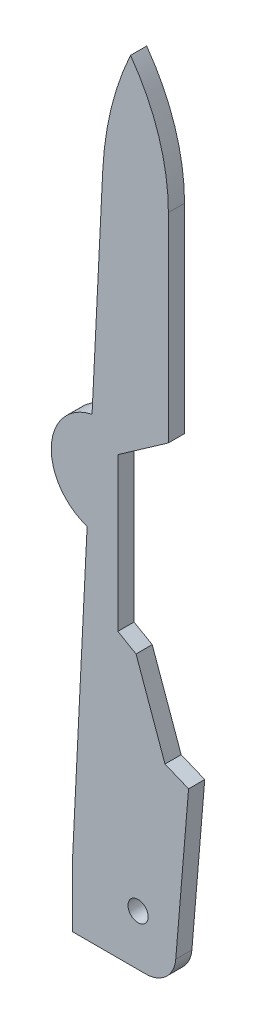
ISO-10303-21;
HEADER;
FILE_DESCRIPTION(('STEP AP214'),'2;1');
FILE_NAME('part.step','',(''),(''),'','','');
FILE_SCHEMA(('AUTOMOTIVE_DESIGN { 1 0 10303 214 1 1 1 1 }'));
ENDSEC;
DATA;
#1=APPLICATION_CONTEXT('core data for automotive mechanical design processes');
#2=APPLICATION_PROTOCOL_DEFINITION('international standard','automotive_design',2000,#1);
#3=PRODUCT_CONTEXT('',#1,'mechanical');
#4=PRODUCT('Part','Part','',(#3));
#5=PRODUCT_RELATED_PRODUCT_CATEGORY('part','',(#4));
#6=PRODUCT_DEFINITION_FORMATION('','',#4);
#7=PRODUCT_DEFINITION_CONTEXT('part definition',#1,'design');
#8=PRODUCT_DEFINITION('design','',#6,#7);
#9=PRODUCT_DEFINITION_SHAPE('','',#8);
#10=(LENGTH_UNIT() NAMED_UNIT(*) SI_UNIT(.MILLI.,.METRE.));
#11=(NAMED_UNIT(*) PLANE_ANGLE_UNIT() SI_UNIT($,.RADIAN.));
#12=(NAMED_UNIT(*) SI_UNIT($,.STERADIAN.) SOLID_ANGLE_UNIT());
#13=UNCERTAINTY_MEASURE_WITH_UNIT(LENGTH_MEASURE(1.E-05),#10,'distance_accuracy_value','');
#14=(GEOMETRIC_REPRESENTATION_CONTEXT(3) GLOBAL_UNCERTAINTY_ASSIGNED_CONTEXT((#13)) GLOBAL_UNIT_ASSIGNED_CONTEXT((#10,
#11,#12)) REPRESENTATION_CONTEXT('',''));
#15=CARTESIAN_POINT('',(0.,0.,0.));
#16=DIRECTION('',(0.,0.,1.));
#17=DIRECTION('',(1.,0.,0.));
#18=AXIS2_PLACEMENT_3D('',#15,#16,#17);
#19=CARTESIAN_POINT('',(-10.3297860874718,66.3956518642348,0.8));
#20=DIRECTION('',(0.,0.,-1.));
#21=DIRECTION('',(-1.,0.,0.));
#22=AXIS2_PLACEMENT_3D('',#19,#20,#21);
#23=CYLINDRICAL_SURFACE('',#22,19.8297860874718);
#24=CARTESIAN_POINT('',(-10.3297860874718,66.3956518642348,-0.8));
#25=DIRECTION('',(0.,0.,1.));
#26=DIRECTION('',(1.,0.,0.));
#27=AXIS2_PLACEMENT_3D('',#24,#25,#26);
#28=CIRCLE('',#27,19.8297860874718);
#29=CARTESIAN_POINT('',(5.75,78.,-0.8));
#30=VERTEX_POINT('',#29);
#31=CARTESIAN_POINT('',(9.5,66.3956518642348,-0.8));
#32=VERTEX_POINT('',#31);
#33=EDGE_CURVE('E150',#30,#32,#28,.F.);
#34=ORIENTED_EDGE('',*,*,#33,.F.);
#35=DIRECTION('',(0.,0.,-1.));
#36=VECTOR('',#35,1.);
#37=CARTESIAN_POINT('',(5.75,78.,0.8));
#38=LINE('',#37,#36);
#39=CARTESIAN_POINT('',(5.75,78.,0.8));
#40=VERTEX_POINT('',#39);
#41=EDGE_CURVE('E145',#40,#30,#38,.T.);
#42=ORIENTED_EDGE('',*,*,#41,.F.);
#43=CARTESIAN_POINT('',(-10.3297860874718,66.3956518642348,0.8));
#44=DIRECTION('',(0.,0.,1.));
#45=DIRECTION('',(1.,0.,0.));
#46=AXIS2_PLACEMENT_3D('',#43,#44,#45);
#47=CIRCLE('',#46,19.8297860874718);
#48=CARTESIAN_POINT('',(9.5,66.3956518642348,0.8));
#49=VERTEX_POINT('',#48);
#50=EDGE_CURVE('E147',#40,#49,#47,.F.);
#51=ORIENTED_EDGE('',*,*,#50,.T.);
#52=DIRECTION('',(0.,0.,-1.));
#53=VECTOR('',#52,1.);
#54=CARTESIAN_POINT('',(9.5,66.3956518642348,0.8));
#55=LINE('',#54,#53);
#56=EDGE_CURVE('E216',#49,#32,#55,.T.);
#57=ORIENTED_EDGE('',*,*,#56,.T.);
#58=EDGE_LOOP('',(#34,#42,#51,#57));
#59=FACE_BOUND('',#58,.T.);
#60=ADVANCED_FACE('F39',(#59),#23,.T.);
#61=CARTESIAN_POINT('',(33.3163707689621,65.310181743202,0.8));
#62=DIRECTION('',(0.,0.,-1.));
#63=DIRECTION('',(-1.,0.,0.));
#64=AXIS2_PLACEMENT_3D('',#61,#62,#63);
#65=CYLINDRICAL_SURFACE('',#64,30.3469320486017);
#66=CARTESIAN_POINT('',(33.3163707689621,65.310181743202,-0.8));
#67=DIRECTION('',(0.,0.,1.));
#68=DIRECTION('',(1.,0.,0.));
#69=AXIS2_PLACEMENT_3D('',#66,#67,#68);
#70=CIRCLE('',#69,30.3469320486017);
#71=CARTESIAN_POINT('',(3.00646147496188,66.808742169722,-0.8));
#72=VERTEX_POINT('',#71);
#73=EDGE_CURVE('E219',#72,#30,#70,.F.);
#74=ORIENTED_EDGE('',*,*,#73,.F.);
#75=DIRECTION('',(0.,0.,-1.));
#76=VECTOR('',#75,1.);
#77=CARTESIAN_POINT('',(3.00646147496188,66.808742169722,0.8));
#78=LINE('',#77,#76);
#79=CARTESIAN_POINT('',(3.00646147496188,66.808742169722,0.8));
#80=VERTEX_POINT('',#79);
#81=EDGE_CURVE('E157',#80,#72,#78,.T.);
#82=ORIENTED_EDGE('',*,*,#81,.F.);
#83=CARTESIAN_POINT('',(33.3163707689621,65.310181743202,0.8));
#84=DIRECTION('',(0.,0.,1.));
#85=DIRECTION('',(1.,0.,0.));
#86=AXIS2_PLACEMENT_3D('',#83,#84,#85);
#87=CIRCLE('',#86,30.3469320486017);
#88=EDGE_CURVE('E163',#80,#40,#87,.F.);
#89=ORIENTED_EDGE('',*,*,#88,.T.);
#90=ORIENTED_EDGE('',*,*,#41,.T.);
#91=EDGE_LOOP('',(#74,#82,#89,#90));
#92=FACE_BOUND('',#91,.T.);
#93=ADVANCED_FACE('F171',(#92),#65,.T.);
#94=CARTESIAN_POINT('',(-0.29592425459345,0.0146308711411731,0.8));
#95=DIRECTION('',(-0.998780016558437,0.0493809530439505,0.));
#96=DIRECTION('',(-0.0493809530439505,-0.998780016558437,0.));
#97=AXIS2_PLACEMENT_3D('',#94,#95,#96);
#98=PLANE('',#97);
#99=DIRECTION('',(0.0493809530439505,0.998780016558437,0.));
#100=VECTOR('',#99,1.);
#101=CARTESIAN_POINT('',(-0.29592425459345,0.0146308711411731,-0.8));
#102=LINE('',#101,#100);
#103=CARTESIAN_POINT('',(1.9444534210038,45.3285487685662,-0.8));
#104=VERTEX_POINT('',#103);
#105=EDGE_CURVE('E223',#104,#72,#102,.T.);
#106=ORIENTED_EDGE('',*,*,#105,.F.);
#107=DIRECTION('',(0.,0.,-1.));
#108=VECTOR('',#107,1.);
#109=CARTESIAN_POINT('',(1.9444534210038,45.3285487685662,0.8));
#110=LINE('',#109,#108);
#111=CARTESIAN_POINT('',(1.9444534210038,45.3285487685662,0.8));
#112=VERTEX_POINT('',#111);
#113=EDGE_CURVE('E295',#112,#104,#110,.T.);
#114=ORIENTED_EDGE('',*,*,#113,.F.);
#115=DIRECTION('',(0.0493809530439505,0.998780016558437,0.));
#116=VECTOR('',#115,1.);
#117=CARTESIAN_POINT('',(-0.29592425459345,0.0146308711411731,0.8));
#118=LINE('',#117,#116);
#119=EDGE_CURVE('E173',#112,#80,#118,.T.);
#120=ORIENTED_EDGE('',*,*,#119,.T.);
#121=ORIENTED_EDGE('',*,*,#81,.T.);
#122=EDGE_LOOP('',(#106,#114,#120,#121));
#123=FACE_BOUND('',#122,.T.);
#124=ADVANCED_FACE('F353',(#123),#98,.T.);
#125=CARTESIAN_POINT('',(3.00646147496188,40.3403488033154,0.8));
#126=DIRECTION('',(0.,0.,-1.));
#127=DIRECTION('',(-1.,0.,0.));
#128=AXIS2_PLACEMENT_3D('',#125,#126,#127);
#129=CYLINDRICAL_SURFACE('',#128,5.1);
#130=CARTESIAN_POINT('',(3.00646147496188,40.3403488033154,-0.8));
#131=DIRECTION('',(0.,0.,1.));
#132=DIRECTION('',(1.,0.,0.));
#133=AXIS2_PLACEMENT_3D('',#130,#131,#132);
#134=CIRCLE('',#133,5.1);
#135=CARTESIAN_POINT('',(1.45758966983994,35.4812340556172,-0.8));
#136=VERTEX_POINT('',#135);
#137=EDGE_CURVE('E227',#104,#136,#134,.T.);
#138=ORIENTED_EDGE('',*,*,#137,.T.);
#139=DIRECTION('',(0.,0.,-1.));
#140=VECTOR('',#139,1.);
#141=CARTESIAN_POINT('',(1.45758966983994,35.4812340556172,0.8));
#142=LINE('',#141,#140);
#143=CARTESIAN_POINT('',(1.45758966983994,35.4812340556172,0.8));
#144=VERTEX_POINT('',#143);
#145=EDGE_CURVE('E292',#144,#136,#142,.T.);
#146=ORIENTED_EDGE('',*,*,#145,.F.);
#147=CARTESIAN_POINT('',(3.00646147496188,40.3403488033154,0.8));
#148=DIRECTION('',(0.,0.,1.));
#149=DIRECTION('',(1.,0.,0.));
#150=AXIS2_PLACEMENT_3D('',#147,#148,#149);
#151=CIRCLE('',#150,5.1);
#152=EDGE_CURVE('E176',#112,#144,#151,.T.);
#153=ORIENTED_EDGE('',*,*,#152,.F.);
#154=ORIENTED_EDGE('',*,*,#113,.T.);
#155=EDGE_LOOP('',(#138,#146,#153,#154));
#156=FACE_BOUND('',#155,.T.);
#157=ADVANCED_FACE('F355',(#156),#129,.T.);
#158=CARTESIAN_POINT('',(0.,6.,-0.8));
#159=VERTEX_POINT('',#158);
#160=EDGE_CURVE('E228',#159,#136,#102,.T.);
#161=ORIENTED_EDGE('',*,*,#160,.F.);
#162=DIRECTION('',(0.,0.,-1.));
#163=VECTOR('',#162,1.);
#164=CARTESIAN_POINT('',(0.,6.,0.8));
#165=LINE('',#164,#163);
#166=CARTESIAN_POINT('',(0.,6.,0.8));
#167=VERTEX_POINT('',#166);
#168=EDGE_CURVE('E289',#167,#159,#165,.T.);
#169=ORIENTED_EDGE('',*,*,#168,.F.);
#170=EDGE_CURVE('E178',#167,#144,#118,.T.);
#171=ORIENTED_EDGE('',*,*,#170,.T.);
#172=ORIENTED_EDGE('',*,*,#145,.T.);
#173=EDGE_LOOP('',(#161,#169,#171,#172));
#174=FACE_BOUND('',#173,.T.);
#175=ADVANCED_FACE('F310',(#174),#98,.T.);
#176=CARTESIAN_POINT('',(0.,0.,0.8));
#177=DIRECTION('',(-1.,0.,0.));
#178=DIRECTION('',(0.,0.,1.));
#179=AXIS2_PLACEMENT_3D('',#176,#177,#178);
#180=PLANE('',#179);
#181=DIRECTION('',(0.,1.,0.));
#182=VECTOR('',#181,1.);
#183=CARTESIAN_POINT('',(0.,0.,-0.8));
#184=LINE('',#183,#182);
#185=CARTESIAN_POINT('',(0.,0.,-0.8));
#186=VERTEX_POINT('',#185);
#187=EDGE_CURVE('E232',#186,#159,#184,.T.);
#188=ORIENTED_EDGE('',*,*,#187,.F.);
#189=DIRECTION('',(0.,0.,-1.));
#190=VECTOR('',#189,1.);
#191=CARTESIAN_POINT('',(0.,0.,0.8));
#192=LINE('',#191,#190);
#193=CARTESIAN_POINT('',(0.,0.,0.8));
#194=VERTEX_POINT('',#193);
#195=EDGE_CURVE('E285',#194,#186,#192,.T.);
#196=ORIENTED_EDGE('',*,*,#195,.F.);
#197=DIRECTION('',(0.,1.,0.));
#198=VECTOR('',#197,1.);
#199=CARTESIAN_POINT('',(0.,0.,0.8));
#200=LINE('',#199,#198);
#201=EDGE_CURVE('E183',#194,#167,#200,.T.);
#202=ORIENTED_EDGE('',*,*,#201,.T.);
#203=ORIENTED_EDGE('',*,*,#168,.T.);
#204=EDGE_LOOP('',(#188,#196,#202,#203));
#205=FACE_BOUND('',#204,.T.);
#206=ADVANCED_FACE('F317',(#205),#180,.T.);
#207=CARTESIAN_POINT('',(0.,0.,0.8));
#208=DIRECTION('',(0.,-1.,0.));
#209=DIRECTION('',(0.,0.,-1.));
#210=AXIS2_PLACEMENT_3D('',#207,#208,#209);
#211=PLANE('',#210);
#212=DIRECTION('',(-1.,0.,0.));
#213=VECTOR('',#212,1.);
#214=CARTESIAN_POINT('',(0.,0.,-0.8));
#215=LINE('',#214,#213);
#216=CARTESIAN_POINT('',(7.23966996599457,0.,-0.8));
#217=VERTEX_POINT('',#216);
#218=EDGE_CURVE('E236',#217,#186,#215,.T.);
#219=ORIENTED_EDGE('',*,*,#218,.F.);
#220=DIRECTION('',(0.,0.,-1.));
#221=VECTOR('',#220,1.);
#222=CARTESIAN_POINT('',(7.23966996599457,0.,0.8));
#223=LINE('',#222,#221);
#224=CARTESIAN_POINT('',(7.23966996599457,0.,0.8));
#225=VERTEX_POINT('',#224);
#226=EDGE_CURVE('E48',#217,#225,#223,.F.);
#227=ORIENTED_EDGE('',*,*,#226,.T.);
#228=DIRECTION('',(-1.,0.,0.));
#229=VECTOR('',#228,1.);
#230=CARTESIAN_POINT('',(0.,0.,0.8));
#231=LINE('',#230,#229);
#232=EDGE_CURVE('E187',#225,#194,#231,.T.);
#233=ORIENTED_EDGE('',*,*,#232,.T.);
#234=ORIENTED_EDGE('',*,*,#195,.T.);
#235=EDGE_LOOP('',(#219,#227,#233,#234));
#236=FACE_BOUND('',#235,.T.);
#237=ADVANCED_FACE('F318',(#236),#211,.T.);
#238=CARTESIAN_POINT('',(9.93099347844725,-0.827830487183667,0.8));
#239=DIRECTION('',(0.996543700920699,-0.0830701640498897,0.));
#240=DIRECTION('',(0.0830701640498897,0.9965437009207,0.));
#241=AXIS2_PLACEMENT_3D('',#238,#239,#240);
#242=PLANE('',#241);
#243=DIRECTION('',(-0.0830701640498897,-0.9965437009207,0.));
#244=VECTOR('',#243,1.);
#245=CARTESIAN_POINT('',(9.93099347844725,-0.827830487183667,0.8));
#246=LINE('',#245,#244);
#247=CARTESIAN_POINT('',(11.5,17.9946141731862,0.8));
#248=VERTEX_POINT('',#247);
#249=CARTESIAN_POINT('',(10.2293010687567,2.75078950785033,0.8));
#250=VERTEX_POINT('',#249);
#251=EDGE_CURVE('E190',#248,#250,#246,.T.);
#252=ORIENTED_EDGE('',*,*,#251,.T.);
#253=DIRECTION('',(0.,0.,-1.));
#254=VECTOR('',#253,1.);
#255=CARTESIAN_POINT('',(10.2293010687567,2.75078950785033,0.8));
#256=LINE('',#255,#254);
#257=CARTESIAN_POINT('',(10.2293010687567,2.75078950785033,-0.8));
#258=VERTEX_POINT('',#257);
#259=EDGE_CURVE('E156',#250,#258,#256,.T.);
#260=ORIENTED_EDGE('',*,*,#259,.T.);
#261=DIRECTION('',(-0.0830701640498897,-0.9965437009207,0.));
#262=VECTOR('',#261,1.);
#263=CARTESIAN_POINT('',(9.93099347844725,-0.827830487183667,-0.8));
#264=LINE('',#263,#262);
#265=CARTESIAN_POINT('',(11.5,17.9946141731862,-0.8));
#266=VERTEX_POINT('',#265);
#267=EDGE_CURVE('E239',#266,#258,#264,.T.);
#268=ORIENTED_EDGE('',*,*,#267,.F.);
#269=DIRECTION('',(0.,0.,-1.));
#270=VECTOR('',#269,1.);
#271=CARTESIAN_POINT('',(11.5,17.9946141731862,0.8));
#272=LINE('',#271,#270);
#273=EDGE_CURVE('E282',#248,#266,#272,.T.);
#274=ORIENTED_EDGE('',*,*,#273,.F.);
#275=EDGE_LOOP('',(#252,#260,#268,#274));
#276=FACE_BOUND('',#275,.T.);
#277=ADVANCED_FACE('F325',(#276),#242,.T.);
#278=CARTESIAN_POINT('',(7.97304082843186,19.4410671511285,0.8));
#279=DIRECTION('',(0.379443046104791,0.925215096484443,0.));
#280=DIRECTION('',(-0.925215096484443,0.379443046104791,0.));
#281=AXIS2_PLACEMENT_3D('',#278,#279,#280);
#282=PLANE('',#281);
#283=DIRECTION('',(0.925215096484443,-0.379443046104791,0.));
#284=VECTOR('',#283,1.);
#285=CARTESIAN_POINT('',(7.97304082843186,19.4410671511285,-0.8));
#286=LINE('',#285,#284);
#287=CARTESIAN_POINT('',(9.16578800343431,18.9519056328659,-0.8));
#288=VERTEX_POINT('',#287);
#289=EDGE_CURVE('E242',#288,#266,#286,.T.);
#290=ORIENTED_EDGE('',*,*,#289,.F.);
#291=DIRECTION('',(0.,0.,-1.));
#292=VECTOR('',#291,1.);
#293=CARTESIAN_POINT('',(9.16578800343431,18.9519056328659,0.8));
#294=LINE('',#293,#292);
#295=CARTESIAN_POINT('',(9.16578800343431,18.9519056328659,0.8));
#296=VERTEX_POINT('',#295);
#297=EDGE_CURVE('E279',#296,#288,#294,.T.);
#298=ORIENTED_EDGE('',*,*,#297,.F.);
#299=DIRECTION('',(0.925215096484443,-0.379443046104791,0.));
#300=VECTOR('',#299,1.);
#301=CARTESIAN_POINT('',(7.97304082843186,19.4410671511285,0.8));
#302=LINE('',#301,#300);
#303=EDGE_CURVE('E194',#296,#248,#302,.T.);
#304=ORIENTED_EDGE('',*,*,#303,.T.);
#305=ORIENTED_EDGE('',*,*,#273,.T.);
#306=EDGE_LOOP('',(#290,#298,#304,#305));
#307=FACE_BOUND('',#306,.T.);
#308=ADVANCED_FACE('F330',(#307),#282,.T.);
#309=CARTESIAN_POINT('',(14.1390515593719,5.06273948105965,0.8));
#310=DIRECTION('',(0.941465766924734,0.337108602246847,0.));
#311=DIRECTION('',(-0.337108602246847,0.941465766924734,0.));
#312=AXIS2_PLACEMENT_3D('',#309,#310,#311);
#313=PLANE('',#312);
#314=DIRECTION('',(0.337108602246847,-0.941465766924734,0.));
#315=VECTOR('',#314,1.);
#316=CARTESIAN_POINT('',(14.1390515593719,5.06273948105965,-0.8));
#317=LINE('',#316,#315);
#318=CARTESIAN_POINT('',(6.3,26.9553836886449,-0.8));
#319=VERTEX_POINT('',#318);
#320=EDGE_CURVE('E246',#319,#288,#317,.T.);
#321=ORIENTED_EDGE('',*,*,#320,.F.);
#322=DIRECTION('',(0.,0.,-1.));
#323=VECTOR('',#322,1.);
#324=CARTESIAN_POINT('',(6.3,26.9553836886449,0.8));
#325=LINE('',#324,#323);
#326=CARTESIAN_POINT('',(6.3,26.9553836886449,0.8));
#327=VERTEX_POINT('',#326);
#328=EDGE_CURVE('E276',#327,#319,#325,.T.);
#329=ORIENTED_EDGE('',*,*,#328,.F.);
#330=DIRECTION('',(0.337108602246847,-0.941465766924734,0.));
#331=VECTOR('',#330,1.);
#332=CARTESIAN_POINT('',(14.1390515593719,5.06273948105965,0.8));
#333=LINE('',#332,#331);
#334=EDGE_CURVE('E198',#327,#296,#333,.T.);
#335=ORIENTED_EDGE('',*,*,#334,.T.);
#336=ORIENTED_EDGE('',*,*,#297,.T.);
#337=EDGE_LOOP('',(#321,#329,#335,#336));
#338=FACE_BOUND('',#337,.T.);
#339=ADVANCED_FACE('F335',(#338),#313,.T.);
#340=CARTESIAN_POINT('',(13.2470235215615,22.9445177884047,0.8));
#341=DIRECTION('',(0.499999999999997,0.86602540378444,0.));
#342=DIRECTION('',(-0.86602540378444,0.499999999999997,0.));
#343=AXIS2_PLACEMENT_3D('',#340,#341,#342);
#344=PLANE('',#343);
#345=DIRECTION('',(0.86602540378444,-0.499999999999997,0.));
#346=VECTOR('',#345,1.);
#347=CARTESIAN_POINT('',(13.2470235215615,22.9445177884047,-0.8));
#348=LINE('',#347,#346);
#349=CARTESIAN_POINT('',(4.5,27.9946141731862,-0.8));
#350=VERTEX_POINT('',#349);
#351=EDGE_CURVE('E250',#350,#319,#348,.T.);
#352=ORIENTED_EDGE('',*,*,#351,.F.);
#353=DIRECTION('',(0.,0.,-1.));
#354=VECTOR('',#353,1.);
#355=CARTESIAN_POINT('',(4.5,27.9946141731862,0.8));
#356=LINE('',#355,#354);
#357=CARTESIAN_POINT('',(4.5,27.9946141731862,0.8));
#358=VERTEX_POINT('',#357);
#359=EDGE_CURVE('E273',#358,#350,#356,.T.);
#360=ORIENTED_EDGE('',*,*,#359,.F.);
#361=DIRECTION('',(0.86602540378444,-0.499999999999997,0.));
#362=VECTOR('',#361,1.);
#363=CARTESIAN_POINT('',(13.2470235215615,22.9445177884047,0.8));
#364=LINE('',#363,#362);
#365=EDGE_CURVE('E202',#358,#327,#364,.T.);
#366=ORIENTED_EDGE('',*,*,#365,.T.);
#367=ORIENTED_EDGE('',*,*,#328,.T.);
#368=EDGE_LOOP('',(#352,#360,#366,#367));
#369=FACE_BOUND('',#368,.T.);
#370=ADVANCED_FACE('F338',(#369),#344,.T.);
#371=CARTESIAN_POINT('',(4.50000000000001,0.,0.8));
#372=DIRECTION('',(1.,0.,0.));
#373=DIRECTION('',(0.,1.,0.));
#374=AXIS2_PLACEMENT_3D('',#371,#372,#373);
#375=PLANE('',#374);
#376=DIRECTION('',(0.,-1.,0.));
#377=VECTOR('',#376,1.);
#378=CARTESIAN_POINT('',(4.50000000000001,0.,-0.8));
#379=LINE('',#378,#377);
#380=CARTESIAN_POINT('',(4.5,43.1446141731862,-0.8));
#381=VERTEX_POINT('',#380);
#382=EDGE_CURVE('E254',#381,#350,#379,.T.);
#383=ORIENTED_EDGE('',*,*,#382,.F.);
#384=DIRECTION('',(0.,0.,-1.));
#385=VECTOR('',#384,1.);
#386=CARTESIAN_POINT('',(4.5,43.1446141731862,0.8));
#387=LINE('',#386,#385);
#388=CARTESIAN_POINT('',(4.5,43.1446141731862,0.8));
#389=VERTEX_POINT('',#388);
#390=EDGE_CURVE('E270',#389,#381,#387,.T.);
#391=ORIENTED_EDGE('',*,*,#390,.F.);
#392=DIRECTION('',(0.,-1.,0.));
#393=VECTOR('',#392,1.);
#394=CARTESIAN_POINT('',(4.50000000000001,0.,0.8));
#395=LINE('',#394,#393);
#396=EDGE_CURVE('E206',#389,#358,#395,.T.);
#397=ORIENTED_EDGE('',*,*,#396,.T.);
#398=ORIENTED_EDGE('',*,*,#359,.T.);
#399=EDGE_LOOP('',(#383,#391,#397,#398));
#400=FACE_BOUND('',#399,.T.);
#401=ADVANCED_FACE('F342',(#400),#375,.T.);
#402=CARTESIAN_POINT('',(-18.7908831050818,26.8361622514468,0.8));
#403=DIRECTION('',(0.573576436351045,-0.819152044288993,0.));
#404=DIRECTION('',(0.819152044288993,0.573576436351045,0.));
#405=AXIS2_PLACEMENT_3D('',#402,#403,#404);
#406=PLANE('',#405);
#407=DIRECTION('',(-0.819152044288993,-0.573576436351045,0.));
#408=VECTOR('',#407,1.);
#409=CARTESIAN_POINT('',(-18.7908831050818,26.8361622514468,-0.8));
#410=LINE('',#409,#408);
#411=CARTESIAN_POINT('',(9.5,46.6456518642348,-0.8));
#412=VERTEX_POINT('',#411);
#413=EDGE_CURVE('E258',#412,#381,#410,.T.);
#414=ORIENTED_EDGE('',*,*,#413,.F.);
#415=DIRECTION('',(0.,0.,-1.));
#416=VECTOR('',#415,1.);
#417=CARTESIAN_POINT('',(9.5,46.6456518642348,0.8));
#418=LINE('',#417,#416);
#419=CARTESIAN_POINT('',(9.5,46.6456518642348,0.8));
#420=VERTEX_POINT('',#419);
#421=EDGE_CURVE('E267',#420,#412,#418,.T.);
#422=ORIENTED_EDGE('',*,*,#421,.F.);
#423=DIRECTION('',(-0.819152044288993,-0.573576436351045,0.));
#424=VECTOR('',#423,1.);
#425=CARTESIAN_POINT('',(-18.7908831050818,26.8361622514468,0.8));
#426=LINE('',#425,#424);
#427=EDGE_CURVE('E210',#420,#389,#426,.T.);
#428=ORIENTED_EDGE('',*,*,#427,.T.);
#429=ORIENTED_EDGE('',*,*,#390,.T.);
#430=EDGE_LOOP('',(#414,#422,#428,#429));
#431=FACE_BOUND('',#430,.T.);
#432=ADVANCED_FACE('F345',(#431),#406,.T.);
#433=CARTESIAN_POINT('',(9.5,0.,0.8));
#434=DIRECTION('',(1.,0.,0.));
#435=DIRECTION('',(0.,0.,-1.));
#436=AXIS2_PLACEMENT_3D('',#433,#434,#435);
#437=PLANE('',#436);
#438=DIRECTION('',(0.,-1.,0.));
#439=VECTOR('',#438,1.);
#440=CARTESIAN_POINT('',(9.5,0.,-0.8));
#441=LINE('',#440,#439);
#442=EDGE_CURVE('E169',#32,#412,#441,.T.);
#443=ORIENTED_EDGE('',*,*,#442,.F.);
#444=ORIENTED_EDGE('',*,*,#56,.F.);
#445=DIRECTION('',(0.,-1.,0.));
#446=VECTOR('',#445,1.);
#447=CARTESIAN_POINT('',(9.5,0.,0.8));
#448=LINE('',#447,#446);
#449=EDGE_CURVE('E167',#49,#420,#448,.T.);
#450=ORIENTED_EDGE('',*,*,#449,.T.);
#451=ORIENTED_EDGE('',*,*,#421,.T.);
#452=EDGE_LOOP('',(#443,#444,#450,#451));
#453=FACE_BOUND('',#452,.T.);
#454=ADVANCED_FACE('F348',(#453),#437,.T.);
#455=CARTESIAN_POINT('',(0.,0.,0.8));
#456=DIRECTION('',(0.,0.,1.));
#457=DIRECTION('',(1.,0.,0.));
#458=AXIS2_PLACEMENT_3D('',#455,#456,#457);
#459=PLANE('',#458);
#460=CARTESIAN_POINT('',(6.5,5.01349847956687,0.8));
#461=DIRECTION('',(0.,0.,1.));
#462=DIRECTION('',(1.,0.,0.));
#463=AXIS2_PLACEMENT_3D('',#460,#461,#462);
#464=CIRCLE('',#463,1.);
#465=CARTESIAN_POINT('',(7.5,5.01349847956687,0.8));
#466=VERTEX_POINT('',#465);
#467=EDGE_CURVE('E360',#466,#466,#464,.T.);
#468=ORIENTED_EDGE('',*,*,#467,.F.);
#469=EDGE_LOOP('',(#468));
#470=FACE_BOUND('',#469,.T.);
#471=ORIENTED_EDGE('',*,*,#232,.F.);
#472=CARTESIAN_POINT('',(7.23966996599457,3.,0.8));
#473=DIRECTION('',(0.,0.,1.));
#474=DIRECTION('',(1.,0.,0.));
#475=AXIS2_PLACEMENT_3D('',#472,#473,#474);
#476=CIRCLE('',#475,3.);
#477=EDGE_CURVE('E11',#225,#250,#476,.T.);
#478=ORIENTED_EDGE('',*,*,#477,.T.);
#479=ORIENTED_EDGE('',*,*,#251,.F.);
#480=ORIENTED_EDGE('',*,*,#303,.F.);
#481=ORIENTED_EDGE('',*,*,#334,.F.);
#482=ORIENTED_EDGE('',*,*,#365,.F.);
#483=ORIENTED_EDGE('',*,*,#396,.F.);
#484=ORIENTED_EDGE('',*,*,#427,.F.);
#485=ORIENTED_EDGE('',*,*,#449,.F.);
#486=ORIENTED_EDGE('',*,*,#50,.F.);
#487=ORIENTED_EDGE('',*,*,#88,.F.);
#488=ORIENTED_EDGE('',*,*,#119,.F.);
#489=ORIENTED_EDGE('',*,*,#152,.T.);
#490=ORIENTED_EDGE('',*,*,#170,.F.);
#491=ORIENTED_EDGE('',*,*,#201,.F.);
#492=EDGE_LOOP('',(#471,#478,#479,#480,#481,#482,#483,#484,#485,#486,#487,#488,#489,#490,#491));
#493=FACE_BOUND('',#492,.T.);
#494=ADVANCED_FACE('F161',(#470,#493),#459,.T.);
#495=CARTESIAN_POINT('',(0.,0.,-0.8));
#496=DIRECTION('',(0.,0.,1.));
#497=DIRECTION('',(1.,0.,0.));
#498=AXIS2_PLACEMENT_3D('',#495,#496,#497);
#499=PLANE('',#498);
#500=CARTESIAN_POINT('',(6.5,5.01349847956687,-0.8));
#501=DIRECTION('',(0.,0.,1.));
#502=DIRECTION('',(1.,0.,0.));
#503=AXIS2_PLACEMENT_3D('',#500,#501,#502);
#504=CIRCLE('',#503,1.);
#505=CARTESIAN_POINT('',(7.5,5.01349847956687,-0.8));
#506=VERTEX_POINT('',#505);
#507=EDGE_CURVE('E220',#506,#506,#504,.T.);
#508=ORIENTED_EDGE('',*,*,#507,.T.);
#509=EDGE_LOOP('',(#508));
#510=FACE_BOUND('',#509,.T.);
#511=ORIENTED_EDGE('',*,*,#267,.T.);
#512=CARTESIAN_POINT('',(7.23966996599457,3.,-0.8));
#513=DIRECTION('',(0.,0.,1.));
#514=DIRECTION('',(1.,0.,0.));
#515=AXIS2_PLACEMENT_3D('',#512,#513,#514);
#516=CIRCLE('',#515,3.);
#517=EDGE_CURVE('E62',#258,#217,#516,.F.);
#518=ORIENTED_EDGE('',*,*,#517,.T.);
#519=ORIENTED_EDGE('',*,*,#218,.T.);
#520=ORIENTED_EDGE('',*,*,#187,.T.);
#521=ORIENTED_EDGE('',*,*,#160,.T.);
#522=ORIENTED_EDGE('',*,*,#137,.F.);
#523=ORIENTED_EDGE('',*,*,#105,.T.);
#524=ORIENTED_EDGE('',*,*,#73,.T.);
#525=ORIENTED_EDGE('',*,*,#33,.T.);
#526=ORIENTED_EDGE('',*,*,#442,.T.);
#527=ORIENTED_EDGE('',*,*,#413,.T.);
#528=ORIENTED_EDGE('',*,*,#382,.T.);
#529=ORIENTED_EDGE('',*,*,#351,.T.);
#530=ORIENTED_EDGE('',*,*,#320,.T.);
#531=ORIENTED_EDGE('',*,*,#289,.T.);
#532=EDGE_LOOP('',(#511,#518,#519,#520,#521,#522,#523,#524,#525,#526,#527,#528,#529,#530,#531));
#533=FACE_BOUND('',#532,.T.);
#534=ADVANCED_FACE('F326',(#510,#533),#499,.F.);
#535=CARTESIAN_POINT('',(7.23966996599457,3.,0.8));
#536=DIRECTION('',(0.,0.,-1.));
#537=DIRECTION('',(-1.,0.,0.));
#538=AXIS2_PLACEMENT_3D('',#535,#536,#537);
#539=CYLINDRICAL_SURFACE('',#538,3.);
#540=ORIENTED_EDGE('',*,*,#477,.F.);
#541=ORIENTED_EDGE('',*,*,#226,.F.);
#542=ORIENTED_EDGE('',*,*,#517,.F.);
#543=ORIENTED_EDGE('',*,*,#259,.F.);
#544=EDGE_LOOP('',(#540,#541,#542,#543));
#545=FACE_BOUND('',#544,.T.);
#546=ADVANCED_FACE('F41',(#545),#539,.T.);
#547=CARTESIAN_POINT('',(6.5,5.01349847956687,-0.8));
#548=DIRECTION('',(0.,0.,1.));
#549=DIRECTION('',(1.,0.,0.));
#550=AXIS2_PLACEMENT_3D('',#547,#548,#549);
#551=CYLINDRICAL_SURFACE('',#550,1.);
#552=ORIENTED_EDGE('',*,*,#507,.F.);
#553=EDGE_LOOP('',(#552));
#554=FACE_BOUND('',#553,.T.);
#555=ORIENTED_EDGE('',*,*,#467,.T.);
#556=EDGE_LOOP('',(#555));
#557=FACE_BOUND('',#556,.T.);
#558=ADVANCED_FACE('F365',(#554,#557),#551,.F.);
#559=CLOSED_SHELL('',(#60,#93,#124,#157,#175,#206,#237,#277,#308,#339,#370,#401,#432,#454,#494,
#534,#546,#558));
#560=MANIFOLD_SOLID_BREP('B2',#559);
#561=ADVANCED_BREP_SHAPE_REPRESENTATION('',(#18,#560),#14);
#562=SHAPE_DEFINITION_REPRESENTATION(#9,#561);
ENDSEC;
END-ISO-10303-21;
